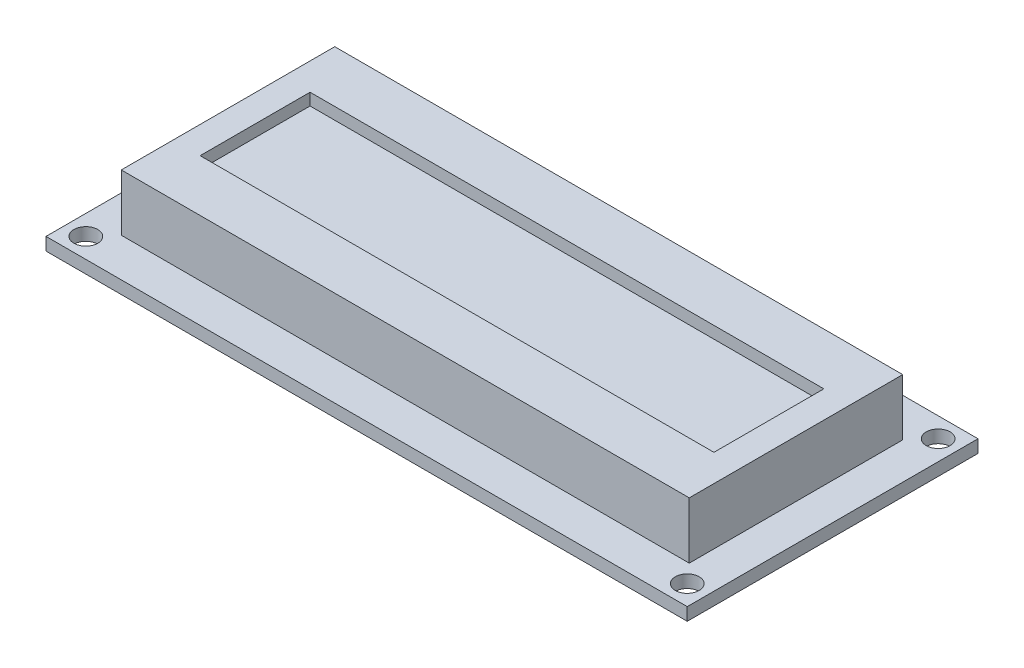
ISO-10303-21;
HEADER;
FILE_DESCRIPTION(('STEP AP214'),'2;1');
FILE_NAME('part.step','',(''),(''),'','','');
FILE_SCHEMA(('AUTOMOTIVE_DESIGN { 1 0 10303 214 1 1 1 1 }'));
ENDSEC;
DATA;
#1=APPLICATION_CONTEXT('core data for automotive mechanical design processes');
#2=APPLICATION_PROTOCOL_DEFINITION('international standard','automotive_design',2000,#1);
#3=PRODUCT_CONTEXT('',#1,'mechanical');
#4=PRODUCT('Part','Part','',(#3));
#5=PRODUCT_RELATED_PRODUCT_CATEGORY('part','',(#4));
#6=PRODUCT_DEFINITION_FORMATION('','',#4);
#7=PRODUCT_DEFINITION_CONTEXT('part definition',#1,'design');
#8=PRODUCT_DEFINITION('design','',#6,#7);
#9=PRODUCT_DEFINITION_SHAPE('','',#8);
#10=(LENGTH_UNIT() NAMED_UNIT(*) SI_UNIT(.MILLI.,.METRE.));
#11=(NAMED_UNIT(*) PLANE_ANGLE_UNIT() SI_UNIT($,.RADIAN.));
#12=(NAMED_UNIT(*) SI_UNIT($,.STERADIAN.) SOLID_ANGLE_UNIT());
#13=UNCERTAINTY_MEASURE_WITH_UNIT(LENGTH_MEASURE(1.E-05),#10,'distance_accuracy_value','');
#14=(GEOMETRIC_REPRESENTATION_CONTEXT(3) GLOBAL_UNCERTAINTY_ASSIGNED_CONTEXT((#13)) GLOBAL_UNIT_ASSIGNED_CONTEXT((#10,
#11,#12)) REPRESENTATION_CONTEXT('',''));
#15=CARTESIAN_POINT('',(0.,0.,0.));
#16=DIRECTION('',(0.,0.,1.));
#17=DIRECTION('',(1.,0.,0.));
#18=AXIS2_PLACEMENT_3D('',#15,#16,#17);
#19=CARTESIAN_POINT('',(0.,1.6,0.));
#20=DIRECTION('',(0.,-1.,0.));
#21=DIRECTION('',(0.,0.,-1.));
#22=AXIS2_PLACEMENT_3D('',#19,#20,#21);
#23=PLANE('',#22);
#24=CARTESIAN_POINT('',(-32.25,1.6,-15.75));
#25=DIRECTION('',(0.,1.,0.));
#26=DIRECTION('',(0.,0.,1.));
#27=AXIS2_PLACEMENT_3D('',#24,#25,#26);
#28=CIRCLE('',#27,0.499999999999999);
#29=CARTESIAN_POINT('',(-32.25,1.6,-15.25));
#30=VERTEX_POINT('',#29);
#31=EDGE_CURVE('E192',#30,#30,#28,.T.);
#32=ORIENTED_EDGE('',*,*,#31,.F.);
#33=EDGE_LOOP('',(#32));
#34=FACE_BOUND('',#33,.T.);
#35=CARTESIAN_POINT('',(-29.71,1.6,-15.75));
#36=DIRECTION('',(0.,1.,0.));
#37=DIRECTION('',(0.,0.,1.));
#38=AXIS2_PLACEMENT_3D('',#35,#36,#37);
#39=CIRCLE('',#38,0.499999999999999);
#40=CARTESIAN_POINT('',(-29.71,1.6,-15.25));
#41=VERTEX_POINT('',#40);
#42=EDGE_CURVE('E197',#41,#41,#39,.T.);
#43=ORIENTED_EDGE('',*,*,#42,.F.);
#44=EDGE_LOOP('',(#43));
#45=FACE_BOUND('',#44,.T.);
#46=CARTESIAN_POINT('',(-27.17,1.6,-15.75));
#47=DIRECTION('',(0.,1.,0.));
#48=DIRECTION('',(0.,0.,1.));
#49=AXIS2_PLACEMENT_3D('',#46,#47,#48);
#50=CIRCLE('',#49,0.499999999999999);
#51=CARTESIAN_POINT('',(-27.17,1.6,-15.25));
#52=VERTEX_POINT('',#51);
#53=EDGE_CURVE('E201',#52,#52,#50,.T.);
#54=ORIENTED_EDGE('',*,*,#53,.F.);
#55=EDGE_LOOP('',(#54));
#56=FACE_BOUND('',#55,.T.);
#57=CARTESIAN_POINT('',(-24.63,1.6,-15.75));
#58=DIRECTION('',(0.,1.,0.));
#59=DIRECTION('',(0.,0.,1.));
#60=AXIS2_PLACEMENT_3D('',#57,#58,#59);
#61=CIRCLE('',#60,0.499999999999999);
#62=CARTESIAN_POINT('',(-24.63,1.6,-15.25));
#63=VERTEX_POINT('',#62);
#64=EDGE_CURVE('E205',#63,#63,#61,.T.);
#65=ORIENTED_EDGE('',*,*,#64,.F.);
#66=EDGE_LOOP('',(#65));
#67=FACE_BOUND('',#66,.T.);
#68=CARTESIAN_POINT('',(-22.09,1.6,-15.75));
#69=DIRECTION('',(0.,1.,0.));
#70=DIRECTION('',(0.,0.,1.));
#71=AXIS2_PLACEMENT_3D('',#68,#69,#70);
#72=CIRCLE('',#71,0.499999999999999);
#73=CARTESIAN_POINT('',(-22.09,1.6,-15.25));
#74=VERTEX_POINT('',#73);
#75=EDGE_CURVE('E209',#74,#74,#72,.T.);
#76=ORIENTED_EDGE('',*,*,#75,.F.);
#77=EDGE_LOOP('',(#76));
#78=FACE_BOUND('',#77,.T.);
#79=CARTESIAN_POINT('',(-19.55,1.6,-15.75));
#80=DIRECTION('',(0.,1.,0.));
#81=DIRECTION('',(0.,0.,1.));
#82=AXIS2_PLACEMENT_3D('',#79,#80,#81);
#83=CIRCLE('',#82,0.499999999999999);
#84=CARTESIAN_POINT('',(-19.55,1.6,-15.25));
#85=VERTEX_POINT('',#84);
#86=EDGE_CURVE('E213',#85,#85,#83,.T.);
#87=ORIENTED_EDGE('',*,*,#86,.F.);
#88=EDGE_LOOP('',(#87));
#89=FACE_BOUND('',#88,.T.);
#90=CARTESIAN_POINT('',(-17.01,1.6,-15.75));
#91=DIRECTION('',(0.,1.,0.));
#92=DIRECTION('',(0.,0.,1.));
#93=AXIS2_PLACEMENT_3D('',#90,#91,#92);
#94=CIRCLE('',#93,0.499999999999999);
#95=CARTESIAN_POINT('',(-17.01,1.6,-15.25));
#96=VERTEX_POINT('',#95);
#97=EDGE_CURVE('E217',#96,#96,#94,.T.);
#98=ORIENTED_EDGE('',*,*,#97,.F.);
#99=EDGE_LOOP('',(#98));
#100=FACE_BOUND('',#99,.T.);
#101=CARTESIAN_POINT('',(-14.47,1.6,-15.75));
#102=DIRECTION('',(0.,1.,0.));
#103=DIRECTION('',(0.,0.,1.));
#104=AXIS2_PLACEMENT_3D('',#101,#102,#103);
#105=CIRCLE('',#104,0.499999999999999);
#106=CARTESIAN_POINT('',(-14.47,1.6,-15.25));
#107=VERTEX_POINT('',#106);
#108=EDGE_CURVE('E221',#107,#107,#105,.T.);
#109=ORIENTED_EDGE('',*,*,#108,.F.);
#110=EDGE_LOOP('',(#109));
#111=FACE_BOUND('',#110,.T.);
#112=CARTESIAN_POINT('',(-11.93,1.6,-15.75));
#113=DIRECTION('',(0.,1.,0.));
#114=DIRECTION('',(0.,0.,1.));
#115=AXIS2_PLACEMENT_3D('',#112,#113,#114);
#116=CIRCLE('',#115,0.499999999999999);
#117=CARTESIAN_POINT('',(-11.93,1.6,-15.25));
#118=VERTEX_POINT('',#117);
#119=EDGE_CURVE('E225',#118,#118,#116,.T.);
#120=ORIENTED_EDGE('',*,*,#119,.F.);
#121=EDGE_LOOP('',(#120));
#122=FACE_BOUND('',#121,.T.);
#123=CARTESIAN_POINT('',(-9.39000000000002,1.6,-15.75));
#124=DIRECTION('',(0.,1.,0.));
#125=DIRECTION('',(0.,0.,1.));
#126=AXIS2_PLACEMENT_3D('',#123,#124,#125);
#127=CIRCLE('',#126,0.499999999999999);
#128=CARTESIAN_POINT('',(-9.39000000000002,1.6,-15.25));
#129=VERTEX_POINT('',#128);
#130=EDGE_CURVE('E229',#129,#129,#127,.T.);
#131=ORIENTED_EDGE('',*,*,#130,.F.);
#132=EDGE_LOOP('',(#131));
#133=FACE_BOUND('',#132,.T.);
#134=CARTESIAN_POINT('',(-6.85000000000002,1.6,-15.75));
#135=DIRECTION('',(0.,1.,0.));
#136=DIRECTION('',(0.,0.,1.));
#137=AXIS2_PLACEMENT_3D('',#134,#135,#136);
#138=CIRCLE('',#137,0.499999999999999);
#139=CARTESIAN_POINT('',(-6.85000000000002,1.6,-15.25));
#140=VERTEX_POINT('',#139);
#141=EDGE_CURVE('E233',#140,#140,#138,.T.);
#142=ORIENTED_EDGE('',*,*,#141,.F.);
#143=EDGE_LOOP('',(#142));
#144=FACE_BOUND('',#143,.T.);
#145=CARTESIAN_POINT('',(-4.31000000000002,1.6,-15.75));
#146=DIRECTION('',(0.,1.,0.));
#147=DIRECTION('',(0.,0.,1.));
#148=AXIS2_PLACEMENT_3D('',#145,#146,#147);
#149=CIRCLE('',#148,0.499999999999999);
#150=CARTESIAN_POINT('',(-4.31000000000002,1.6,-15.25));
#151=VERTEX_POINT('',#150);
#152=EDGE_CURVE('E237',#151,#151,#149,.T.);
#153=ORIENTED_EDGE('',*,*,#152,.F.);
#154=EDGE_LOOP('',(#153));
#155=FACE_BOUND('',#154,.T.);
#156=CARTESIAN_POINT('',(-1.77000000000002,1.6,-15.75));
#157=DIRECTION('',(0.,1.,0.));
#158=DIRECTION('',(0.,0.,1.));
#159=AXIS2_PLACEMENT_3D('',#156,#157,#158);
#160=CIRCLE('',#159,0.499999999999999);
#161=CARTESIAN_POINT('',(-1.77000000000002,1.6,-15.25));
#162=VERTEX_POINT('',#161);
#163=EDGE_CURVE('E241',#162,#162,#160,.T.);
#164=ORIENTED_EDGE('',*,*,#163,.F.);
#165=EDGE_LOOP('',(#164));
#166=FACE_BOUND('',#165,.T.);
#167=CARTESIAN_POINT('',(0.769999999999979,1.6,-15.75));
#168=DIRECTION('',(0.,1.,0.));
#169=DIRECTION('',(0.,0.,1.));
#170=AXIS2_PLACEMENT_3D('',#167,#168,#169);
#171=CIRCLE('',#170,0.499999999999999);
#172=CARTESIAN_POINT('',(0.769999999999979,1.6,-15.25));
#173=VERTEX_POINT('',#172);
#174=EDGE_CURVE('E245',#173,#173,#171,.T.);
#175=ORIENTED_EDGE('',*,*,#174,.F.);
#176=EDGE_LOOP('',(#175));
#177=FACE_BOUND('',#176,.T.);
#178=CARTESIAN_POINT('',(3.30999999999998,1.6,-15.75));
#179=DIRECTION('',(0.,1.,0.));
#180=DIRECTION('',(0.,0.,1.));
#181=AXIS2_PLACEMENT_3D('',#178,#179,#180);
#182=CIRCLE('',#181,0.499999999999999);
#183=CARTESIAN_POINT('',(3.30999999999998,1.6,-15.25));
#184=VERTEX_POINT('',#183);
#185=EDGE_CURVE('E249',#184,#184,#182,.T.);
#186=ORIENTED_EDGE('',*,*,#185,.F.);
#187=EDGE_LOOP('',(#186));
#188=FACE_BOUND('',#187,.T.);
#189=CARTESIAN_POINT('',(5.84999999999998,1.6,-15.75));
#190=DIRECTION('',(0.,1.,0.));
#191=DIRECTION('',(0.,0.,1.));
#192=AXIS2_PLACEMENT_3D('',#189,#190,#191);
#193=CIRCLE('',#192,0.499999999999999);
#194=CARTESIAN_POINT('',(5.84999999999998,1.6,-15.25));
#195=VERTEX_POINT('',#194);
#196=EDGE_CURVE('E186',#195,#195,#193,.T.);
#197=ORIENTED_EDGE('',*,*,#196,.F.);
#198=EDGE_LOOP('',(#197));
#199=FACE_BOUND('',#198,.T.);
#200=DIRECTION('',(0.,0.,-1.));
#201=VECTOR('',#200,1.);
#202=CARTESIAN_POINT('',(40.25,1.6,18.25));
#203=LINE('',#202,#201);
#204=CARTESIAN_POINT('',(40.25,1.6,18.25));
#205=VERTEX_POINT('',#204);
#206=CARTESIAN_POINT('',(40.25,1.6,-18.25));
#207=VERTEX_POINT('',#206);
#208=EDGE_CURVE('E331',#205,#207,#203,.T.);
#209=ORIENTED_EDGE('',*,*,#208,.T.);
#210=DIRECTION('',(-1.,0.,0.));
#211=VECTOR('',#210,1.);
#212=CARTESIAN_POINT('',(-40.25,1.6,-18.25));
#213=LINE('',#212,#211);
#214=CARTESIAN_POINT('',(-40.25,1.6,-18.25));
#215=VERTEX_POINT('',#214);
#216=EDGE_CURVE('E335',#207,#215,#213,.T.);
#217=ORIENTED_EDGE('',*,*,#216,.T.);
#218=DIRECTION('',(0.,0.,1.));
#219=VECTOR('',#218,1.);
#220=CARTESIAN_POINT('',(-40.25,1.6,18.25));
#221=LINE('',#220,#219);
#222=CARTESIAN_POINT('',(-40.25,1.6,18.25));
#223=VERTEX_POINT('',#222);
#224=EDGE_CURVE('E339',#215,#223,#221,.T.);
#225=ORIENTED_EDGE('',*,*,#224,.T.);
#226=DIRECTION('',(1.,0.,0.));
#227=VECTOR('',#226,1.);
#228=CARTESIAN_POINT('',(-40.25,1.6,18.25));
#229=LINE('',#228,#227);
#230=EDGE_CURVE('E342',#223,#205,#229,.T.);
#231=ORIENTED_EDGE('',*,*,#230,.T.);
#232=EDGE_LOOP('',(#209,#217,#225,#231));
#233=FACE_BOUND('',#232,.T.);
#234=CARTESIAN_POINT('',(-37.75,1.6,-15.75));
#235=DIRECTION('',(0.,1.,0.));
#236=DIRECTION('',(0.,0.,1.));
#237=AXIS2_PLACEMENT_3D('',#234,#235,#236);
#238=CIRCLE('',#237,1.5);
#239=CARTESIAN_POINT('',(-37.75,1.6,-14.25));
#240=VERTEX_POINT('',#239);
#241=EDGE_CURVE('E311',#240,#240,#238,.T.);
#242=ORIENTED_EDGE('',*,*,#241,.F.);
#243=EDGE_LOOP('',(#242));
#244=FACE_BOUND('',#243,.T.);
#245=CARTESIAN_POINT('',(37.75,1.6,15.75));
#246=DIRECTION('',(0.,1.,0.));
#247=DIRECTION('',(0.,0.,1.));
#248=AXIS2_PLACEMENT_3D('',#245,#246,#247);
#249=CIRCLE('',#248,1.5);
#250=CARTESIAN_POINT('',(37.75,1.6,17.25));
#251=VERTEX_POINT('',#250);
#252=EDGE_CURVE('E299',#251,#251,#249,.T.);
#253=ORIENTED_EDGE('',*,*,#252,.F.);
#254=EDGE_LOOP('',(#253));
#255=FACE_BOUND('',#254,.T.);
#256=CARTESIAN_POINT('',(37.75,1.6,-15.75));
#257=DIRECTION('',(0.,1.,0.));
#258=DIRECTION('',(0.,0.,1.));
#259=AXIS2_PLACEMENT_3D('',#256,#257,#258);
#260=CIRCLE('',#259,1.5);
#261=CARTESIAN_POINT('',(37.75,1.6,-14.25));
#262=VERTEX_POINT('',#261);
#263=EDGE_CURVE('E316',#262,#262,#260,.T.);
#264=ORIENTED_EDGE('',*,*,#263,.F.);
#265=EDGE_LOOP('',(#264));
#266=FACE_BOUND('',#265,.T.);
#267=CARTESIAN_POINT('',(-37.75,1.6,15.75));
#268=DIRECTION('',(0.,1.,0.));
#269=DIRECTION('',(0.,0.,1.));
#270=AXIS2_PLACEMENT_3D('',#267,#268,#269);
#271=CIRCLE('',#270,1.5);
#272=CARTESIAN_POINT('',(-37.75,1.6,17.25));
#273=VERTEX_POINT('',#272);
#274=EDGE_CURVE('E307',#273,#273,#271,.T.);
#275=ORIENTED_EDGE('',*,*,#274,.F.);
#276=EDGE_LOOP('',(#275));
#277=FACE_BOUND('',#276,.T.);
#278=DIRECTION('',(0.,0.,-1.));
#279=VECTOR('',#278,1.);
#280=CARTESIAN_POINT('',(35.65,1.6,13.399999997));
#281=LINE('',#280,#279);
#282=CARTESIAN_POINT('',(35.65,1.6,13.399999997));
#283=VERTEX_POINT('',#282);
#284=CARTESIAN_POINT('',(35.65,1.6,-13.399999997));
#285=VERTEX_POINT('',#284);
#286=EDGE_CURVE('E271',#283,#285,#281,.T.);
#287=ORIENTED_EDGE('',*,*,#286,.F.);
#288=DIRECTION('',(1.,0.,0.));
#289=VECTOR('',#288,1.);
#290=CARTESIAN_POINT('',(-35.65,1.6,13.399999997));
#291=LINE('',#290,#289);
#292=CARTESIAN_POINT('',(-35.65,1.6,13.399999997));
#293=VERTEX_POINT('',#292);
#294=EDGE_CURVE('E261',#293,#283,#291,.T.);
#295=ORIENTED_EDGE('',*,*,#294,.F.);
#296=DIRECTION('',(0.,0.,1.));
#297=VECTOR('',#296,1.);
#298=CARTESIAN_POINT('',(-35.65,1.6,13.399999997));
#299=LINE('',#298,#297);
#300=CARTESIAN_POINT('',(-35.65,1.6,-13.399999997));
#301=VERTEX_POINT('',#300);
#302=EDGE_CURVE('E277',#301,#293,#299,.T.);
#303=ORIENTED_EDGE('',*,*,#302,.F.);
#304=DIRECTION('',(-1.,0.,0.));
#305=VECTOR('',#304,1.);
#306=CARTESIAN_POINT('',(-35.65,1.6,-13.399999997));
#307=LINE('',#306,#305);
#308=EDGE_CURVE('E75',#285,#301,#307,.T.);
#309=ORIENTED_EDGE('',*,*,#308,.F.);
#310=EDGE_LOOP('',(#287,#295,#303,#309));
#311=FACE_BOUND('',#310,.T.);
#312=ADVANCED_FACE('F49',(#34,#45,#56,#67,#78,#89,#100,#111,#122,#133,#144,#155,#166,#177,#188,
#199,#233,#244,#255,#266,#277,#311),#23,.F.);
#313=CARTESIAN_POINT('',(40.25,1.6,18.25));
#314=DIRECTION('',(-1.,0.,0.));
#315=DIRECTION('',(0.,0.,1.));
#316=AXIS2_PLACEMENT_3D('',#313,#314,#315);
#317=PLANE('',#316);
#318=DIRECTION('',(0.,0.,-1.));
#319=VECTOR('',#318,1.);
#320=CARTESIAN_POINT('',(40.25,0.,18.25));
#321=LINE('',#320,#319);
#322=CARTESIAN_POINT('',(40.25,0.,18.25));
#323=VERTEX_POINT('',#322);
#324=CARTESIAN_POINT('',(40.25,0.,-18.25));
#325=VERTEX_POINT('',#324);
#326=EDGE_CURVE('E327',#323,#325,#321,.T.);
#327=ORIENTED_EDGE('',*,*,#326,.T.);
#328=DIRECTION('',(0.,-1.,0.));
#329=VECTOR('',#328,1.);
#330=CARTESIAN_POINT('',(40.25,1.6,-18.25));
#331=LINE('',#330,#329);
#332=EDGE_CURVE('E11',#207,#325,#331,.T.);
#333=ORIENTED_EDGE('',*,*,#332,.F.);
#334=ORIENTED_EDGE('',*,*,#208,.F.);
#335=DIRECTION('',(0.,-1.,0.));
#336=VECTOR('',#335,1.);
#337=CARTESIAN_POINT('',(40.25,1.6,18.25));
#338=LINE('',#337,#336);
#339=EDGE_CURVE('E345',#205,#323,#338,.T.);
#340=ORIENTED_EDGE('',*,*,#339,.T.);
#341=EDGE_LOOP('',(#327,#333,#334,#340));
#342=FACE_BOUND('',#341,.T.);
#343=ADVANCED_FACE('F51',(#342),#317,.F.);
#344=CARTESIAN_POINT('',(-40.25,1.6,-18.25));
#345=DIRECTION('',(0.,0.,1.));
#346=DIRECTION('',(1.,0.,0.));
#347=AXIS2_PLACEMENT_3D('',#344,#345,#346);
#348=PLANE('',#347);
#349=DIRECTION('',(-1.,0.,0.));
#350=VECTOR('',#349,1.);
#351=CARTESIAN_POINT('',(-40.25,0.,-18.25));
#352=LINE('',#351,#350);
#353=CARTESIAN_POINT('',(-40.25,0.,-18.25));
#354=VERTEX_POINT('',#353);
#355=EDGE_CURVE('E349',#325,#354,#352,.T.);
#356=ORIENTED_EDGE('',*,*,#355,.T.);
#357=DIRECTION('',(0.,-1.,0.));
#358=VECTOR('',#357,1.);
#359=CARTESIAN_POINT('',(-40.25,1.6,-18.25));
#360=LINE('',#359,#358);
#361=EDGE_CURVE('E59',#215,#354,#360,.T.);
#362=ORIENTED_EDGE('',*,*,#361,.F.);
#363=ORIENTED_EDGE('',*,*,#216,.F.);
#364=ORIENTED_EDGE('',*,*,#332,.T.);
#365=EDGE_LOOP('',(#356,#362,#363,#364));
#366=FACE_BOUND('',#365,.T.);
#367=ADVANCED_FACE('F491',(#366),#348,.F.);
#368=CARTESIAN_POINT('',(-40.25,1.6,18.25));
#369=DIRECTION('',(1.,0.,0.));
#370=DIRECTION('',(0.,0.,-1.));
#371=AXIS2_PLACEMENT_3D('',#368,#369,#370);
#372=PLANE('',#371);
#373=DIRECTION('',(0.,0.,1.));
#374=VECTOR('',#373,1.);
#375=CARTESIAN_POINT('',(-40.25,0.,18.25));
#376=LINE('',#375,#374);
#377=CARTESIAN_POINT('',(-40.25,0.,18.25));
#378=VERTEX_POINT('',#377);
#379=EDGE_CURVE('E352',#354,#378,#376,.T.);
#380=ORIENTED_EDGE('',*,*,#379,.T.);
#381=DIRECTION('',(0.,-1.,0.));
#382=VECTOR('',#381,1.);
#383=CARTESIAN_POINT('',(-40.25,1.6,18.25));
#384=LINE('',#383,#382);
#385=EDGE_CURVE('E360',#223,#378,#384,.T.);
#386=ORIENTED_EDGE('',*,*,#385,.F.);
#387=ORIENTED_EDGE('',*,*,#224,.F.);
#388=ORIENTED_EDGE('',*,*,#361,.T.);
#389=EDGE_LOOP('',(#380,#386,#387,#388));
#390=FACE_BOUND('',#389,.T.);
#391=ADVANCED_FACE('F488',(#390),#372,.F.);
#392=CARTESIAN_POINT('',(-40.25,1.6,18.25));
#393=DIRECTION('',(0.,0.,-1.));
#394=DIRECTION('',(-1.,0.,0.));
#395=AXIS2_PLACEMENT_3D('',#392,#393,#394);
#396=PLANE('',#395);
#397=DIRECTION('',(1.,0.,0.));
#398=VECTOR('',#397,1.);
#399=CARTESIAN_POINT('',(-40.25,0.,18.25));
#400=LINE('',#399,#398);
#401=EDGE_CURVE('E336',#378,#323,#400,.T.);
#402=ORIENTED_EDGE('',*,*,#401,.T.);
#403=ORIENTED_EDGE('',*,*,#339,.F.);
#404=ORIENTED_EDGE('',*,*,#230,.F.);
#405=ORIENTED_EDGE('',*,*,#385,.T.);
#406=EDGE_LOOP('',(#402,#403,#404,#405));
#407=FACE_BOUND('',#406,.T.);
#408=ADVANCED_FACE('F437',(#407),#396,.F.);
#409=CARTESIAN_POINT('',(0.,0.,0.));
#410=DIRECTION('',(0.,-1.,0.));
#411=DIRECTION('',(0.,0.,-1.));
#412=AXIS2_PLACEMENT_3D('',#409,#410,#411);
#413=PLANE('',#412);
#414=CARTESIAN_POINT('',(-32.25,0.,-15.75));
#415=DIRECTION('',(0.,-1.,0.));
#416=DIRECTION('',(0.,0.,-1.));
#417=AXIS2_PLACEMENT_3D('',#414,#415,#416);
#418=CIRCLE('',#417,0.499999999999999);
#419=CARTESIAN_POINT('',(-32.25,0.,-16.25));
#420=VERTEX_POINT('',#419);
#421=EDGE_CURVE('E53',#420,#420,#418,.T.);
#422=ORIENTED_EDGE('',*,*,#421,.F.);
#423=EDGE_LOOP('',(#422));
#424=FACE_BOUND('',#423,.T.);
#425=CARTESIAN_POINT('',(-29.71,0.,-15.75));
#426=DIRECTION('',(0.,-1.,0.));
#427=DIRECTION('',(0.,0.,-1.));
#428=AXIS2_PLACEMENT_3D('',#425,#426,#427);
#429=CIRCLE('',#428,0.499999999999999);
#430=CARTESIAN_POINT('',(-29.71,0.,-16.25));
#431=VERTEX_POINT('',#430);
#432=EDGE_CURVE('E421',#431,#431,#429,.T.);
#433=ORIENTED_EDGE('',*,*,#432,.F.);
#434=EDGE_LOOP('',(#433));
#435=FACE_BOUND('',#434,.T.);
#436=CARTESIAN_POINT('',(-27.17,0.,-15.75));
#437=DIRECTION('',(0.,-1.,0.));
#438=DIRECTION('',(0.,0.,-1.));
#439=AXIS2_PLACEMENT_3D('',#436,#437,#438);
#440=CIRCLE('',#439,0.499999999999999);
#441=CARTESIAN_POINT('',(-27.17,0.,-16.25));
#442=VERTEX_POINT('',#441);
#443=EDGE_CURVE('E418',#442,#442,#440,.T.);
#444=ORIENTED_EDGE('',*,*,#443,.F.);
#445=EDGE_LOOP('',(#444));
#446=FACE_BOUND('',#445,.T.);
#447=CARTESIAN_POINT('',(-24.63,0.,-15.75));
#448=DIRECTION('',(0.,-1.,0.));
#449=DIRECTION('',(0.,0.,-1.));
#450=AXIS2_PLACEMENT_3D('',#447,#448,#449);
#451=CIRCLE('',#450,0.499999999999999);
#452=CARTESIAN_POINT('',(-24.63,0.,-16.25));
#453=VERTEX_POINT('',#452);
#454=EDGE_CURVE('E414',#453,#453,#451,.T.);
#455=ORIENTED_EDGE('',*,*,#454,.F.);
#456=EDGE_LOOP('',(#455));
#457=FACE_BOUND('',#456,.T.);
#458=CARTESIAN_POINT('',(-22.09,0.,-15.75));
#459=DIRECTION('',(0.,-1.,0.));
#460=DIRECTION('',(0.,0.,-1.));
#461=AXIS2_PLACEMENT_3D('',#458,#459,#460);
#462=CIRCLE('',#461,0.499999999999999);
#463=CARTESIAN_POINT('',(-22.09,0.,-16.25));
#464=VERTEX_POINT('',#463);
#465=EDGE_CURVE('E410',#464,#464,#462,.T.);
#466=ORIENTED_EDGE('',*,*,#465,.F.);
#467=EDGE_LOOP('',(#466));
#468=FACE_BOUND('',#467,.T.);
#469=CARTESIAN_POINT('',(-19.55,0.,-15.75));
#470=DIRECTION('',(0.,-1.,0.));
#471=DIRECTION('',(0.,0.,-1.));
#472=AXIS2_PLACEMENT_3D('',#469,#470,#471);
#473=CIRCLE('',#472,0.499999999999999);
#474=CARTESIAN_POINT('',(-19.55,0.,-16.25));
#475=VERTEX_POINT('',#474);
#476=EDGE_CURVE('E406',#475,#475,#473,.T.);
#477=ORIENTED_EDGE('',*,*,#476,.F.);
#478=EDGE_LOOP('',(#477));
#479=FACE_BOUND('',#478,.T.);
#480=CARTESIAN_POINT('',(-17.01,0.,-15.75));
#481=DIRECTION('',(0.,-1.,0.));
#482=DIRECTION('',(0.,0.,-1.));
#483=AXIS2_PLACEMENT_3D('',#480,#481,#482);
#484=CIRCLE('',#483,0.499999999999999);
#485=CARTESIAN_POINT('',(-17.01,0.,-16.25));
#486=VERTEX_POINT('',#485);
#487=EDGE_CURVE('E402',#486,#486,#484,.T.);
#488=ORIENTED_EDGE('',*,*,#487,.F.);
#489=EDGE_LOOP('',(#488));
#490=FACE_BOUND('',#489,.T.);
#491=CARTESIAN_POINT('',(-14.47,0.,-15.75));
#492=DIRECTION('',(0.,-1.,0.));
#493=DIRECTION('',(0.,0.,-1.));
#494=AXIS2_PLACEMENT_3D('',#491,#492,#493);
#495=CIRCLE('',#494,0.499999999999999);
#496=CARTESIAN_POINT('',(-14.47,0.,-16.25));
#497=VERTEX_POINT('',#496);
#498=EDGE_CURVE('E398',#497,#497,#495,.T.);
#499=ORIENTED_EDGE('',*,*,#498,.F.);
#500=EDGE_LOOP('',(#499));
#501=FACE_BOUND('',#500,.T.);
#502=CARTESIAN_POINT('',(-11.93,0.,-15.75));
#503=DIRECTION('',(0.,-1.,0.));
#504=DIRECTION('',(0.,0.,-1.));
#505=AXIS2_PLACEMENT_3D('',#502,#503,#504);
#506=CIRCLE('',#505,0.499999999999999);
#507=CARTESIAN_POINT('',(-11.93,0.,-16.25));
#508=VERTEX_POINT('',#507);
#509=EDGE_CURVE('E394',#508,#508,#506,.T.);
#510=ORIENTED_EDGE('',*,*,#509,.F.);
#511=EDGE_LOOP('',(#510));
#512=FACE_BOUND('',#511,.T.);
#513=CARTESIAN_POINT('',(-9.39000000000002,0.,-15.75));
#514=DIRECTION('',(0.,-1.,0.));
#515=DIRECTION('',(0.,0.,-1.));
#516=AXIS2_PLACEMENT_3D('',#513,#514,#515);
#517=CIRCLE('',#516,0.499999999999999);
#518=CARTESIAN_POINT('',(-9.39000000000002,0.,-16.25));
#519=VERTEX_POINT('',#518);
#520=EDGE_CURVE('E390',#519,#519,#517,.T.);
#521=ORIENTED_EDGE('',*,*,#520,.F.);
#522=EDGE_LOOP('',(#521));
#523=FACE_BOUND('',#522,.T.);
#524=CARTESIAN_POINT('',(-6.85000000000002,0.,-15.75));
#525=DIRECTION('',(0.,-1.,0.));
#526=DIRECTION('',(0.,0.,-1.));
#527=AXIS2_PLACEMENT_3D('',#524,#525,#526);
#528=CIRCLE('',#527,0.499999999999999);
#529=CARTESIAN_POINT('',(-6.85000000000002,0.,-16.25));
#530=VERTEX_POINT('',#529);
#531=EDGE_CURVE('E386',#530,#530,#528,.T.);
#532=ORIENTED_EDGE('',*,*,#531,.F.);
#533=EDGE_LOOP('',(#532));
#534=FACE_BOUND('',#533,.T.);
#535=CARTESIAN_POINT('',(-4.31000000000002,0.,-15.75));
#536=DIRECTION('',(0.,-1.,0.));
#537=DIRECTION('',(0.,0.,-1.));
#538=AXIS2_PLACEMENT_3D('',#535,#536,#537);
#539=CIRCLE('',#538,0.499999999999999);
#540=CARTESIAN_POINT('',(-4.31000000000002,0.,-16.25));
#541=VERTEX_POINT('',#540);
#542=EDGE_CURVE('E382',#541,#541,#539,.T.);
#543=ORIENTED_EDGE('',*,*,#542,.F.);
#544=EDGE_LOOP('',(#543));
#545=FACE_BOUND('',#544,.T.);
#546=CARTESIAN_POINT('',(-1.77000000000002,0.,-15.75));
#547=DIRECTION('',(0.,-1.,0.));
#548=DIRECTION('',(0.,0.,-1.));
#549=AXIS2_PLACEMENT_3D('',#546,#547,#548);
#550=CIRCLE('',#549,0.499999999999999);
#551=CARTESIAN_POINT('',(-1.77000000000002,0.,-16.25));
#552=VERTEX_POINT('',#551);
#553=EDGE_CURVE('E378',#552,#552,#550,.T.);
#554=ORIENTED_EDGE('',*,*,#553,.F.);
#555=EDGE_LOOP('',(#554));
#556=FACE_BOUND('',#555,.T.);
#557=CARTESIAN_POINT('',(0.769999999999979,0.,-15.75));
#558=DIRECTION('',(0.,-1.,0.));
#559=DIRECTION('',(0.,0.,-1.));
#560=AXIS2_PLACEMENT_3D('',#557,#558,#559);
#561=CIRCLE('',#560,0.499999999999999);
#562=CARTESIAN_POINT('',(0.769999999999979,0.,-16.25));
#563=VERTEX_POINT('',#562);
#564=EDGE_CURVE('E374',#563,#563,#561,.T.);
#565=ORIENTED_EDGE('',*,*,#564,.F.);
#566=EDGE_LOOP('',(#565));
#567=FACE_BOUND('',#566,.T.);
#568=CARTESIAN_POINT('',(3.30999999999998,0.,-15.75));
#569=DIRECTION('',(0.,-1.,0.));
#570=DIRECTION('',(0.,0.,-1.));
#571=AXIS2_PLACEMENT_3D('',#568,#569,#570);
#572=CIRCLE('',#571,0.499999999999999);
#573=CARTESIAN_POINT('',(3.30999999999998,0.,-16.25));
#574=VERTEX_POINT('',#573);
#575=EDGE_CURVE('E370',#574,#574,#572,.T.);
#576=ORIENTED_EDGE('',*,*,#575,.F.);
#577=EDGE_LOOP('',(#576));
#578=FACE_BOUND('',#577,.T.);
#579=CARTESIAN_POINT('',(5.84999999999998,0.,-15.75));
#580=DIRECTION('',(0.,-1.,0.));
#581=DIRECTION('',(0.,0.,-1.));
#582=AXIS2_PLACEMENT_3D('',#579,#580,#581);
#583=CIRCLE('',#582,0.499999999999999);
#584=CARTESIAN_POINT('',(5.84999999999998,0.,-16.25));
#585=VERTEX_POINT('',#584);
#586=EDGE_CURVE('E196',#585,#585,#583,.T.);
#587=ORIENTED_EDGE('',*,*,#586,.F.);
#588=EDGE_LOOP('',(#587));
#589=FACE_BOUND('',#588,.T.);
#590=CARTESIAN_POINT('',(-37.75,0.,15.75));
#591=DIRECTION('',(0.,1.,0.));
#592=DIRECTION('',(0.,0.,1.));
#593=AXIS2_PLACEMENT_3D('',#590,#591,#592);
#594=CIRCLE('',#593,1.5);
#595=CARTESIAN_POINT('',(-37.75,0.,17.25));
#596=VERTEX_POINT('',#595);
#597=EDGE_CURVE('E312',#596,#596,#594,.T.);
#598=ORIENTED_EDGE('',*,*,#597,.T.);
#599=EDGE_LOOP('',(#598));
#600=FACE_BOUND('',#599,.T.);
#601=CARTESIAN_POINT('',(37.75,0.,-15.75));
#602=DIRECTION('',(0.,1.,0.));
#603=DIRECTION('',(0.,0.,1.));
#604=AXIS2_PLACEMENT_3D('',#601,#602,#603);
#605=CIRCLE('',#604,1.5);
#606=CARTESIAN_POINT('',(37.75,0.,-14.25));
#607=VERTEX_POINT('',#606);
#608=EDGE_CURVE('E303',#607,#607,#605,.T.);
#609=ORIENTED_EDGE('',*,*,#608,.T.);
#610=EDGE_LOOP('',(#609));
#611=FACE_BOUND('',#610,.T.);
#612=CARTESIAN_POINT('',(37.75,0.,15.75));
#613=DIRECTION('',(0.,1.,0.));
#614=DIRECTION('',(0.,0.,1.));
#615=AXIS2_PLACEMENT_3D('',#612,#613,#614);
#616=CIRCLE('',#615,1.5);
#617=CARTESIAN_POINT('',(37.75,0.,17.25));
#618=VERTEX_POINT('',#617);
#619=EDGE_CURVE('E298',#618,#618,#616,.T.);
#620=ORIENTED_EDGE('',*,*,#619,.T.);
#621=EDGE_LOOP('',(#620));
#622=FACE_BOUND('',#621,.T.);
#623=CARTESIAN_POINT('',(-37.75,0.,-15.75));
#624=DIRECTION('',(0.,1.,0.));
#625=DIRECTION('',(0.,0.,1.));
#626=AXIS2_PLACEMENT_3D('',#623,#624,#625);
#627=CIRCLE('',#626,1.5);
#628=CARTESIAN_POINT('',(-37.75,0.,-14.25));
#629=VERTEX_POINT('',#628);
#630=EDGE_CURVE('E323',#629,#629,#627,.T.);
#631=ORIENTED_EDGE('',*,*,#630,.T.);
#632=EDGE_LOOP('',(#631));
#633=FACE_BOUND('',#632,.T.);
#634=ORIENTED_EDGE('',*,*,#326,.F.);
#635=ORIENTED_EDGE('',*,*,#401,.F.);
#636=ORIENTED_EDGE('',*,*,#379,.F.);
#637=ORIENTED_EDGE('',*,*,#355,.F.);
#638=EDGE_LOOP('',(#634,#635,#636,#637));
#639=FACE_BOUND('',#638,.T.);
#640=ADVANCED_FACE('F433',(#424,#435,#446,#457,#468,#479,#490,#501,#512,#523,#534,#545,#556,
#567,#578,#589,#600,#611,#622,#633,#639),#413,.T.);
#641=CARTESIAN_POINT('',(-37.75,0.,-15.75));
#642=DIRECTION('',(0.,1.,0.));
#643=DIRECTION('',(0.,0.,1.));
#644=AXIS2_PLACEMENT_3D('',#641,#642,#643);
#645=CYLINDRICAL_SURFACE('',#644,1.5);
#646=ORIENTED_EDGE('',*,*,#630,.F.);
#647=EDGE_LOOP('',(#646));
#648=FACE_BOUND('',#647,.T.);
#649=ORIENTED_EDGE('',*,*,#241,.T.);
#650=EDGE_LOOP('',(#649));
#651=FACE_BOUND('',#650,.T.);
#652=ADVANCED_FACE('F436',(#648,#651),#645,.F.);
#653=CARTESIAN_POINT('',(37.75,0.,15.75));
#654=DIRECTION('',(0.,1.,0.));
#655=DIRECTION('',(0.,0.,1.));
#656=AXIS2_PLACEMENT_3D('',#653,#654,#655);
#657=CYLINDRICAL_SURFACE('',#656,1.5);
#658=ORIENTED_EDGE('',*,*,#619,.F.);
#659=EDGE_LOOP('',(#658));
#660=FACE_BOUND('',#659,.T.);
#661=ORIENTED_EDGE('',*,*,#252,.T.);
#662=EDGE_LOOP('',(#661));
#663=FACE_BOUND('',#662,.T.);
#664=ADVANCED_FACE('F532',(#660,#663),#657,.F.);
#665=CARTESIAN_POINT('',(37.75,0.,-15.75));
#666=DIRECTION('',(0.,1.,0.));
#667=DIRECTION('',(0.,0.,1.));
#668=AXIS2_PLACEMENT_3D('',#665,#666,#667);
#669=CYLINDRICAL_SURFACE('',#668,1.5);
#670=ORIENTED_EDGE('',*,*,#608,.F.);
#671=EDGE_LOOP('',(#670));
#672=FACE_BOUND('',#671,.T.);
#673=ORIENTED_EDGE('',*,*,#263,.T.);
#674=EDGE_LOOP('',(#673));
#675=FACE_BOUND('',#674,.T.);
#676=ADVANCED_FACE('F535',(#672,#675),#669,.F.);
#677=CARTESIAN_POINT('',(-37.75,0.,15.75));
#678=DIRECTION('',(0.,1.,0.));
#679=DIRECTION('',(0.,0.,1.));
#680=AXIS2_PLACEMENT_3D('',#677,#678,#679);
#681=CYLINDRICAL_SURFACE('',#680,1.5);
#682=ORIENTED_EDGE('',*,*,#597,.F.);
#683=EDGE_LOOP('',(#682));
#684=FACE_BOUND('',#683,.T.);
#685=ORIENTED_EDGE('',*,*,#274,.T.);
#686=EDGE_LOOP('',(#685));
#687=FACE_BOUND('',#686,.T.);
#688=ADVANCED_FACE('F528',(#684,#687),#681,.F.);
#689=CARTESIAN_POINT('',(35.65,8.7,13.399999997));
#690=DIRECTION('',(-1.,0.,0.));
#691=DIRECTION('',(0.,0.,1.));
#692=AXIS2_PLACEMENT_3D('',#689,#690,#691);
#693=PLANE('',#692);
#694=ORIENTED_EDGE('',*,*,#286,.T.);
#695=DIRECTION('',(0.,-1.,0.));
#696=VECTOR('',#695,1.);
#697=CARTESIAN_POINT('',(35.65,8.7,-13.399999997));
#698=LINE('',#697,#696);
#699=CARTESIAN_POINT('',(35.65,8.7,-13.399999997));
#700=VERTEX_POINT('',#699);
#701=EDGE_CURVE('E295',#700,#285,#698,.T.);
#702=ORIENTED_EDGE('',*,*,#701,.F.);
#703=DIRECTION('',(0.,0.,-1.));
#704=VECTOR('',#703,1.);
#705=CARTESIAN_POINT('',(35.65,8.7,13.399999997));
#706=LINE('',#705,#704);
#707=CARTESIAN_POINT('',(35.65,8.7,13.399999997));
#708=VERTEX_POINT('',#707);
#709=EDGE_CURVE('E256',#708,#700,#706,.T.);
#710=ORIENTED_EDGE('',*,*,#709,.F.);
#711=DIRECTION('',(0.,-1.,0.));
#712=VECTOR('',#711,1.);
#713=CARTESIAN_POINT('',(35.65,8.7,13.399999997));
#714=LINE('',#713,#712);
#715=EDGE_CURVE('E270',#708,#283,#714,.T.);
#716=ORIENTED_EDGE('',*,*,#715,.T.);
#717=EDGE_LOOP('',(#694,#702,#710,#716));
#718=FACE_BOUND('',#717,.T.);
#719=ADVANCED_FACE('F512',(#718),#693,.F.);
#720=CARTESIAN_POINT('',(-35.65,8.7,-13.399999997));
#721=DIRECTION('',(0.,0.,1.));
#722=DIRECTION('',(1.,0.,0.));
#723=AXIS2_PLACEMENT_3D('',#720,#721,#722);
#724=PLANE('',#723);
#725=ORIENTED_EDGE('',*,*,#308,.T.);
#726=DIRECTION('',(0.,-1.,0.));
#727=VECTOR('',#726,1.);
#728=CARTESIAN_POINT('',(-35.65,8.7,-13.399999997));
#729=LINE('',#728,#727);
#730=CARTESIAN_POINT('',(-35.65,8.7,-13.399999997));
#731=VERTEX_POINT('',#730);
#732=EDGE_CURVE('E291',#731,#301,#729,.T.);
#733=ORIENTED_EDGE('',*,*,#732,.F.);
#734=DIRECTION('',(-1.,0.,0.));
#735=VECTOR('',#734,1.);
#736=CARTESIAN_POINT('',(-35.65,8.7,-13.399999997));
#737=LINE('',#736,#735);
#738=EDGE_CURVE('E260',#700,#731,#737,.T.);
#739=ORIENTED_EDGE('',*,*,#738,.F.);
#740=ORIENTED_EDGE('',*,*,#701,.T.);
#741=EDGE_LOOP('',(#725,#733,#739,#740));
#742=FACE_BOUND('',#741,.T.);
#743=ADVANCED_FACE('F520',(#742),#724,.F.);
#744=CARTESIAN_POINT('',(-35.65,8.7,13.399999997));
#745=DIRECTION('',(1.,0.,0.));
#746=DIRECTION('',(0.,0.,-1.));
#747=AXIS2_PLACEMENT_3D('',#744,#745,#746);
#748=PLANE('',#747);
#749=ORIENTED_EDGE('',*,*,#302,.T.);
#750=DIRECTION('',(0.,-1.,0.));
#751=VECTOR('',#750,1.);
#752=CARTESIAN_POINT('',(-35.65,8.7,13.399999997));
#753=LINE('',#752,#751);
#754=CARTESIAN_POINT('',(-35.65,8.7,13.399999997));
#755=VERTEX_POINT('',#754);
#756=EDGE_CURVE('E287',#755,#293,#753,.T.);
#757=ORIENTED_EDGE('',*,*,#756,.F.);
#758=DIRECTION('',(0.,0.,1.));
#759=VECTOR('',#758,1.);
#760=CARTESIAN_POINT('',(-35.65,8.7,13.399999997));
#761=LINE('',#760,#759);
#762=EDGE_CURVE('E264',#731,#755,#761,.T.);
#763=ORIENTED_EDGE('',*,*,#762,.F.);
#764=ORIENTED_EDGE('',*,*,#732,.T.);
#765=EDGE_LOOP('',(#749,#757,#763,#764));
#766=FACE_BOUND('',#765,.T.);
#767=ADVANCED_FACE('F518',(#766),#748,.F.);
#768=CARTESIAN_POINT('',(-35.65,8.7,13.399999997));
#769=DIRECTION('',(0.,0.,-1.));
#770=DIRECTION('',(-1.,0.,0.));
#771=AXIS2_PLACEMENT_3D('',#768,#769,#770);
#772=PLANE('',#771);
#773=ORIENTED_EDGE('',*,*,#294,.T.);
#774=ORIENTED_EDGE('',*,*,#715,.F.);
#775=DIRECTION('',(1.,0.,0.));
#776=VECTOR('',#775,1.);
#777=CARTESIAN_POINT('',(-35.65,8.7,13.399999997));
#778=LINE('',#777,#776);
#779=EDGE_CURVE('E267',#755,#708,#778,.T.);
#780=ORIENTED_EDGE('',*,*,#779,.F.);
#781=ORIENTED_EDGE('',*,*,#756,.T.);
#782=EDGE_LOOP('',(#773,#774,#780,#781));
#783=FACE_BOUND('',#782,.T.);
#784=ADVANCED_FACE('F508',(#783),#772,.F.);
#785=CARTESIAN_POINT('',(0.,8.7,0.));
#786=DIRECTION('',(0.,-1.,0.));
#787=DIRECTION('',(0.,0.,-1.));
#788=AXIS2_PLACEMENT_3D('',#785,#786,#787);
#789=PLANE('',#788);
#790=DIRECTION('',(-1.,0.,0.));
#791=VECTOR('',#790,1.);
#792=CARTESIAN_POINT('',(-32.25,8.7,-6.9));
#793=LINE('',#792,#791);
#794=CARTESIAN_POINT('',(32.25,8.7,-6.9));
#795=VERTEX_POINT('',#794);
#796=CARTESIAN_POINT('',(-32.25,8.7,-6.9));
#797=VERTEX_POINT('',#796);
#798=EDGE_CURVE('E177',#795,#797,#793,.T.);
#799=ORIENTED_EDGE('',*,*,#798,.F.);
#800=DIRECTION('',(0.,0.,-1.));
#801=VECTOR('',#800,1.);
#802=CARTESIAN_POINT('',(32.25,8.7,6.9));
#803=LINE('',#802,#801);
#804=CARTESIAN_POINT('',(32.25,8.7,6.9));
#805=VERTEX_POINT('',#804);
#806=EDGE_CURVE('E67',#805,#795,#803,.T.);
#807=ORIENTED_EDGE('',*,*,#806,.F.);
#808=DIRECTION('',(1.,0.,0.));
#809=VECTOR('',#808,1.);
#810=CARTESIAN_POINT('',(-32.25,8.7,6.9));
#811=LINE('',#810,#809);
#812=CARTESIAN_POINT('',(-32.25,8.7,6.9));
#813=VERTEX_POINT('',#812);
#814=EDGE_CURVE('E164',#813,#805,#811,.T.);
#815=ORIENTED_EDGE('',*,*,#814,.F.);
#816=DIRECTION('',(0.,0.,1.));
#817=VECTOR('',#816,1.);
#818=CARTESIAN_POINT('',(-32.25,8.7,6.9));
#819=LINE('',#818,#817);
#820=EDGE_CURVE('E168',#797,#813,#819,.T.);
#821=ORIENTED_EDGE('',*,*,#820,.F.);
#822=EDGE_LOOP('',(#799,#807,#815,#821));
#823=FACE_BOUND('',#822,.T.);
#824=ORIENTED_EDGE('',*,*,#709,.T.);
#825=ORIENTED_EDGE('',*,*,#738,.T.);
#826=ORIENTED_EDGE('',*,*,#762,.T.);
#827=ORIENTED_EDGE('',*,*,#779,.T.);
#828=EDGE_LOOP('',(#824,#825,#826,#827));
#829=FACE_BOUND('',#828,.T.);
#830=ADVANCED_FACE('F514',(#823,#829),#789,.F.);
#831=CARTESIAN_POINT('',(5.84999999999998,-5.5,-15.75));
#832=DIRECTION('',(0.,1.,0.));
#833=DIRECTION('',(0.,0.,1.));
#834=AXIS2_PLACEMENT_3D('',#831,#832,#833);
#835=CYLINDRICAL_SURFACE('',#834,0.499999999999999);
#836=ORIENTED_EDGE('',*,*,#586,.T.);
#837=EDGE_LOOP('',(#836));
#838=FACE_BOUND('',#837,.T.);
#839=ORIENTED_EDGE('',*,*,#196,.T.);
#840=EDGE_LOOP('',(#839));
#841=FACE_BOUND('',#840,.T.);
#842=ADVANCED_FACE('F585',(#838,#841),#835,.F.);
#843=CARTESIAN_POINT('',(3.30999999999998,-5.5,-15.75));
#844=DIRECTION('',(0.,1.,0.));
#845=DIRECTION('',(0.,0.,1.));
#846=AXIS2_PLACEMENT_3D('',#843,#844,#845);
#847=CYLINDRICAL_SURFACE('',#846,0.499999999999999);
#848=ORIENTED_EDGE('',*,*,#575,.T.);
#849=EDGE_LOOP('',(#848));
#850=FACE_BOUND('',#849,.T.);
#851=ORIENTED_EDGE('',*,*,#185,.T.);
#852=EDGE_LOOP('',(#851));
#853=FACE_BOUND('',#852,.T.);
#854=ADVANCED_FACE('F589',(#850,#853),#847,.F.);
#855=CARTESIAN_POINT('',(0.769999999999979,-5.5,-15.75));
#856=DIRECTION('',(0.,1.,0.));
#857=DIRECTION('',(0.,0.,1.));
#858=AXIS2_PLACEMENT_3D('',#855,#856,#857);
#859=CYLINDRICAL_SURFACE('',#858,0.499999999999999);
#860=ORIENTED_EDGE('',*,*,#564,.T.);
#861=EDGE_LOOP('',(#860));
#862=FACE_BOUND('',#861,.T.);
#863=ORIENTED_EDGE('',*,*,#174,.T.);
#864=EDGE_LOOP('',(#863));
#865=FACE_BOUND('',#864,.T.);
#866=ADVANCED_FACE('F599',(#862,#865),#859,.F.);
#867=CARTESIAN_POINT('',(-1.77000000000002,-5.5,-15.75));
#868=DIRECTION('',(0.,1.,0.));
#869=DIRECTION('',(0.,0.,1.));
#870=AXIS2_PLACEMENT_3D('',#867,#868,#869);
#871=CYLINDRICAL_SURFACE('',#870,0.499999999999999);
#872=ORIENTED_EDGE('',*,*,#553,.T.);
#873=EDGE_LOOP('',(#872));
#874=FACE_BOUND('',#873,.T.);
#875=ORIENTED_EDGE('',*,*,#163,.T.);
#876=EDGE_LOOP('',(#875));
#877=FACE_BOUND('',#876,.T.);
#878=ADVANCED_FACE('F608',(#874,#877),#871,.F.);
#879=CARTESIAN_POINT('',(-4.31000000000002,-5.5,-15.75));
#880=DIRECTION('',(0.,1.,0.));
#881=DIRECTION('',(0.,0.,1.));
#882=AXIS2_PLACEMENT_3D('',#879,#880,#881);
#883=CYLINDRICAL_SURFACE('',#882,0.499999999999999);
#884=ORIENTED_EDGE('',*,*,#542,.T.);
#885=EDGE_LOOP('',(#884));
#886=FACE_BOUND('',#885,.T.);
#887=ORIENTED_EDGE('',*,*,#152,.T.);
#888=EDGE_LOOP('',(#887));
#889=FACE_BOUND('',#888,.T.);
#890=ADVANCED_FACE('F617',(#886,#889),#883,.F.);
#891=CARTESIAN_POINT('',(-6.85000000000002,-5.5,-15.75));
#892=DIRECTION('',(0.,1.,0.));
#893=DIRECTION('',(0.,0.,1.));
#894=AXIS2_PLACEMENT_3D('',#891,#892,#893);
#895=CYLINDRICAL_SURFACE('',#894,0.499999999999999);
#896=ORIENTED_EDGE('',*,*,#531,.T.);
#897=EDGE_LOOP('',(#896));
#898=FACE_BOUND('',#897,.T.);
#899=ORIENTED_EDGE('',*,*,#141,.T.);
#900=EDGE_LOOP('',(#899));
#901=FACE_BOUND('',#900,.T.);
#902=ADVANCED_FACE('F626',(#898,#901),#895,.F.);
#903=CARTESIAN_POINT('',(-9.39000000000002,-5.5,-15.75));
#904=DIRECTION('',(0.,1.,0.));
#905=DIRECTION('',(0.,0.,1.));
#906=AXIS2_PLACEMENT_3D('',#903,#904,#905);
#907=CYLINDRICAL_SURFACE('',#906,0.499999999999999);
#908=ORIENTED_EDGE('',*,*,#520,.T.);
#909=EDGE_LOOP('',(#908));
#910=FACE_BOUND('',#909,.T.);
#911=ORIENTED_EDGE('',*,*,#130,.T.);
#912=EDGE_LOOP('',(#911));
#913=FACE_BOUND('',#912,.T.);
#914=ADVANCED_FACE('F635',(#910,#913),#907,.F.);
#915=CARTESIAN_POINT('',(-11.93,-5.5,-15.75));
#916=DIRECTION('',(0.,1.,0.));
#917=DIRECTION('',(0.,0.,1.));
#918=AXIS2_PLACEMENT_3D('',#915,#916,#917);
#919=CYLINDRICAL_SURFACE('',#918,0.499999999999999);
#920=ORIENTED_EDGE('',*,*,#509,.T.);
#921=EDGE_LOOP('',(#920));
#922=FACE_BOUND('',#921,.T.);
#923=ORIENTED_EDGE('',*,*,#119,.T.);
#924=EDGE_LOOP('',(#923));
#925=FACE_BOUND('',#924,.T.);
#926=ADVANCED_FACE('F644',(#922,#925),#919,.F.);
#927=CARTESIAN_POINT('',(-14.47,-5.5,-15.75));
#928=DIRECTION('',(0.,1.,0.));
#929=DIRECTION('',(0.,0.,1.));
#930=AXIS2_PLACEMENT_3D('',#927,#928,#929);
#931=CYLINDRICAL_SURFACE('',#930,0.499999999999999);
#932=ORIENTED_EDGE('',*,*,#498,.T.);
#933=EDGE_LOOP('',(#932));
#934=FACE_BOUND('',#933,.T.);
#935=ORIENTED_EDGE('',*,*,#108,.T.);
#936=EDGE_LOOP('',(#935));
#937=FACE_BOUND('',#936,.T.);
#938=ADVANCED_FACE('F653',(#934,#937),#931,.F.);
#939=CARTESIAN_POINT('',(-17.01,-5.5,-15.75));
#940=DIRECTION('',(0.,1.,0.));
#941=DIRECTION('',(0.,0.,1.));
#942=AXIS2_PLACEMENT_3D('',#939,#940,#941);
#943=CYLINDRICAL_SURFACE('',#942,0.499999999999999);
#944=ORIENTED_EDGE('',*,*,#487,.T.);
#945=EDGE_LOOP('',(#944));
#946=FACE_BOUND('',#945,.T.);
#947=ORIENTED_EDGE('',*,*,#97,.T.);
#948=EDGE_LOOP('',(#947));
#949=FACE_BOUND('',#948,.T.);
#950=ADVANCED_FACE('F662',(#946,#949),#943,.F.);
#951=CARTESIAN_POINT('',(-19.55,-5.5,-15.75));
#952=DIRECTION('',(0.,1.,0.));
#953=DIRECTION('',(0.,0.,1.));
#954=AXIS2_PLACEMENT_3D('',#951,#952,#953);
#955=CYLINDRICAL_SURFACE('',#954,0.499999999999999);
#956=ORIENTED_EDGE('',*,*,#476,.T.);
#957=EDGE_LOOP('',(#956));
#958=FACE_BOUND('',#957,.T.);
#959=ORIENTED_EDGE('',*,*,#86,.T.);
#960=EDGE_LOOP('',(#959));
#961=FACE_BOUND('',#960,.T.);
#962=ADVANCED_FACE('F671',(#958,#961),#955,.F.);
#963=CARTESIAN_POINT('',(-22.09,-5.5,-15.75));
#964=DIRECTION('',(0.,1.,0.));
#965=DIRECTION('',(0.,0.,1.));
#966=AXIS2_PLACEMENT_3D('',#963,#964,#965);
#967=CYLINDRICAL_SURFACE('',#966,0.499999999999999);
#968=ORIENTED_EDGE('',*,*,#465,.T.);
#969=EDGE_LOOP('',(#968));
#970=FACE_BOUND('',#969,.T.);
#971=ORIENTED_EDGE('',*,*,#75,.T.);
#972=EDGE_LOOP('',(#971));
#973=FACE_BOUND('',#972,.T.);
#974=ADVANCED_FACE('F680',(#970,#973),#967,.F.);
#975=CARTESIAN_POINT('',(-24.63,-5.5,-15.75));
#976=DIRECTION('',(0.,1.,0.));
#977=DIRECTION('',(0.,0.,1.));
#978=AXIS2_PLACEMENT_3D('',#975,#976,#977);
#979=CYLINDRICAL_SURFACE('',#978,0.499999999999999);
#980=ORIENTED_EDGE('',*,*,#454,.T.);
#981=EDGE_LOOP('',(#980));
#982=FACE_BOUND('',#981,.T.);
#983=ORIENTED_EDGE('',*,*,#64,.T.);
#984=EDGE_LOOP('',(#983));
#985=FACE_BOUND('',#984,.T.);
#986=ADVANCED_FACE('F689',(#982,#985),#979,.F.);
#987=CARTESIAN_POINT('',(-27.17,-5.5,-15.75));
#988=DIRECTION('',(0.,1.,0.));
#989=DIRECTION('',(0.,0.,1.));
#990=AXIS2_PLACEMENT_3D('',#987,#988,#989);
#991=CYLINDRICAL_SURFACE('',#990,0.499999999999999);
#992=ORIENTED_EDGE('',*,*,#443,.T.);
#993=EDGE_LOOP('',(#992));
#994=FACE_BOUND('',#993,.T.);
#995=ORIENTED_EDGE('',*,*,#53,.T.);
#996=EDGE_LOOP('',(#995));
#997=FACE_BOUND('',#996,.T.);
#998=ADVANCED_FACE('F698',(#994,#997),#991,.F.);
#999=CARTESIAN_POINT('',(-29.71,-5.5,-15.75));
#1000=DIRECTION('',(0.,1.,0.));
#1001=DIRECTION('',(0.,0.,1.));
#1002=AXIS2_PLACEMENT_3D('',#999,#1000,#1001);
#1003=CYLINDRICAL_SURFACE('',#1002,0.499999999999999);
#1004=ORIENTED_EDGE('',*,*,#432,.T.);
#1005=EDGE_LOOP('',(#1004));
#1006=FACE_BOUND('',#1005,.T.);
#1007=ORIENTED_EDGE('',*,*,#42,.T.);
#1008=EDGE_LOOP('',(#1007));
#1009=FACE_BOUND('',#1008,.T.);
#1010=ADVANCED_FACE('F707',(#1006,#1009),#1003,.F.);
#1011=CARTESIAN_POINT('',(-32.25,-5.5,-15.75));
#1012=DIRECTION('',(0.,1.,0.));
#1013=DIRECTION('',(0.,0.,1.));
#1014=AXIS2_PLACEMENT_3D('',#1011,#1012,#1013);
#1015=CYLINDRICAL_SURFACE('',#1014,0.499999999999999);
#1016=ORIENTED_EDGE('',*,*,#421,.T.);
#1017=EDGE_LOOP('',(#1016));
#1018=FACE_BOUND('',#1017,.T.);
#1019=ORIENTED_EDGE('',*,*,#31,.T.);
#1020=EDGE_LOOP('',(#1019));
#1021=FACE_BOUND('',#1020,.T.);
#1022=ADVANCED_FACE('F430',(#1018,#1021),#1015,.F.);
#1023=CARTESIAN_POINT('',(32.25,7.2,6.9));
#1024=DIRECTION('',(1.,0.,0.));
#1025=DIRECTION('',(0.,0.,-1.));
#1026=AXIS2_PLACEMENT_3D('',#1023,#1024,#1025);
#1027=PLANE('',#1026);
#1028=ORIENTED_EDGE('',*,*,#806,.T.);
#1029=DIRECTION('',(0.,1.,0.));
#1030=VECTOR('',#1029,1.);
#1031=CARTESIAN_POINT('',(32.25,7.2,-6.9));
#1032=LINE('',#1031,#1030);
#1033=CARTESIAN_POINT('',(32.25,7.2,-6.9));
#1034=VERTEX_POINT('',#1033);
#1035=EDGE_CURVE('E139',#1034,#795,#1032,.T.);
#1036=ORIENTED_EDGE('',*,*,#1035,.F.);
#1037=DIRECTION('',(0.,0.,-1.));
#1038=VECTOR('',#1037,1.);
#1039=CARTESIAN_POINT('',(32.25,7.2,6.9));
#1040=LINE('',#1039,#1038);
#1041=CARTESIAN_POINT('',(32.25,7.2,6.9));
#1042=VERTEX_POINT('',#1041);
#1043=EDGE_CURVE('E143',#1042,#1034,#1040,.T.);
#1044=ORIENTED_EDGE('',*,*,#1043,.F.);
#1045=DIRECTION('',(0.,1.,0.));
#1046=VECTOR('',#1045,1.);
#1047=CARTESIAN_POINT('',(32.25,7.2,6.9));
#1048=LINE('',#1047,#1046);
#1049=EDGE_CURVE('E183',#1042,#805,#1048,.T.);
#1050=ORIENTED_EDGE('',*,*,#1049,.T.);
#1051=EDGE_LOOP('',(#1028,#1036,#1044,#1050));
#1052=FACE_BOUND('',#1051,.T.);
#1053=ADVANCED_FACE('F141',(#1052),#1027,.F.);
#1054=CARTESIAN_POINT('',(-32.25,7.2,6.9));
#1055=DIRECTION('',(0.,0.,1.));
#1056=DIRECTION('',(1.,0.,0.));
#1057=AXIS2_PLACEMENT_3D('',#1054,#1055,#1056);
#1058=PLANE('',#1057);
#1059=ORIENTED_EDGE('',*,*,#814,.T.);
#1060=ORIENTED_EDGE('',*,*,#1049,.F.);
#1061=DIRECTION('',(1.,0.,0.));
#1062=VECTOR('',#1061,1.);
#1063=CARTESIAN_POINT('',(-32.25,7.2,6.9));
#1064=LINE('',#1063,#1062);
#1065=CARTESIAN_POINT('',(-32.25,7.2,6.9));
#1066=VERTEX_POINT('',#1065);
#1067=EDGE_CURVE('E150',#1066,#1042,#1064,.T.);
#1068=ORIENTED_EDGE('',*,*,#1067,.F.);
#1069=DIRECTION('',(0.,1.,0.));
#1070=VECTOR('',#1069,1.);
#1071=CARTESIAN_POINT('',(-32.25,7.2,6.9));
#1072=LINE('',#1071,#1070);
#1073=EDGE_CURVE('E187',#1066,#813,#1072,.T.);
#1074=ORIENTED_EDGE('',*,*,#1073,.T.);
#1075=EDGE_LOOP('',(#1059,#1060,#1068,#1074));
#1076=FACE_BOUND('',#1075,.T.);
#1077=ADVANCED_FACE('F740',(#1076),#1058,.F.);
#1078=CARTESIAN_POINT('',(-32.25,7.2,6.9));
#1079=DIRECTION('',(-1.,0.,0.));
#1080=DIRECTION('',(0.,0.,1.));
#1081=AXIS2_PLACEMENT_3D('',#1078,#1079,#1080);
#1082=PLANE('',#1081);
#1083=ORIENTED_EDGE('',*,*,#820,.T.);
#1084=ORIENTED_EDGE('',*,*,#1073,.F.);
#1085=DIRECTION('',(0.,0.,1.));
#1086=VECTOR('',#1085,1.);
#1087=CARTESIAN_POINT('',(-32.25,7.2,6.9));
#1088=LINE('',#1087,#1086);
#1089=CARTESIAN_POINT('',(-32.25,7.2,-6.9));
#1090=VERTEX_POINT('',#1089);
#1091=EDGE_CURVE('E159',#1090,#1066,#1088,.T.);
#1092=ORIENTED_EDGE('',*,*,#1091,.F.);
#1093=DIRECTION('',(0.,1.,0.));
#1094=VECTOR('',#1093,1.);
#1095=CARTESIAN_POINT('',(-32.25,7.2,-6.9));
#1096=LINE('',#1095,#1094);
#1097=EDGE_CURVE('E149',#1090,#797,#1096,.T.);
#1098=ORIENTED_EDGE('',*,*,#1097,.T.);
#1099=EDGE_LOOP('',(#1083,#1084,#1092,#1098));
#1100=FACE_BOUND('',#1099,.T.);
#1101=ADVANCED_FACE('F748',(#1100),#1082,.F.);
#1102=CARTESIAN_POINT('',(-32.25,7.2,-6.9));
#1103=DIRECTION('',(0.,0.,-1.));
#1104=DIRECTION('',(-1.,0.,0.));
#1105=AXIS2_PLACEMENT_3D('',#1102,#1103,#1104);
#1106=PLANE('',#1105);
#1107=ORIENTED_EDGE('',*,*,#798,.T.);
#1108=ORIENTED_EDGE('',*,*,#1097,.F.);
#1109=DIRECTION('',(-1.,0.,0.));
#1110=VECTOR('',#1109,1.);
#1111=CARTESIAN_POINT('',(-32.25,7.2,-6.9));
#1112=LINE('',#1111,#1110);
#1113=EDGE_CURVE('E153',#1034,#1090,#1112,.T.);
#1114=ORIENTED_EDGE('',*,*,#1113,.F.);
#1115=ORIENTED_EDGE('',*,*,#1035,.T.);
#1116=EDGE_LOOP('',(#1107,#1108,#1114,#1115));
#1117=FACE_BOUND('',#1116,.T.);
#1118=ADVANCED_FACE('F154',(#1117),#1106,.F.);
#1119=CARTESIAN_POINT('',(0.,7.2,0.));
#1120=DIRECTION('',(0.,-1.,0.));
#1121=DIRECTION('',(0.,0.,-1.));
#1122=AXIS2_PLACEMENT_3D('',#1119,#1120,#1121);
#1123=PLANE('',#1122);
#1124=ORIENTED_EDGE('',*,*,#1043,.T.);
#1125=ORIENTED_EDGE('',*,*,#1113,.T.);
#1126=ORIENTED_EDGE('',*,*,#1091,.T.);
#1127=ORIENTED_EDGE('',*,*,#1067,.T.);
#1128=EDGE_LOOP('',(#1124,#1125,#1126,#1127));
#1129=FACE_BOUND('',#1128,.T.);
#1130=ADVANCED_FACE('F161',(#1129),#1123,.F.);
#1131=CLOSED_SHELL('',(#312,#343,#367,#391,#408,#640,#652,#664,#676,#688,#719,#743,#767,#784,
#830,#842,#854,#866,#878,#890,#902,#914,#926,#938,#950,#962,#974,#986,#998,#1010,#1022,#1053,
#1077,#1101,#1118,#1130));
#1132=MANIFOLD_SOLID_BREP('B2',#1131);
#1133=ADVANCED_BREP_SHAPE_REPRESENTATION('',(#18,#1132),#14);
#1134=SHAPE_DEFINITION_REPRESENTATION(#9,#1133);
ENDSEC;
END-ISO-10303-21;
